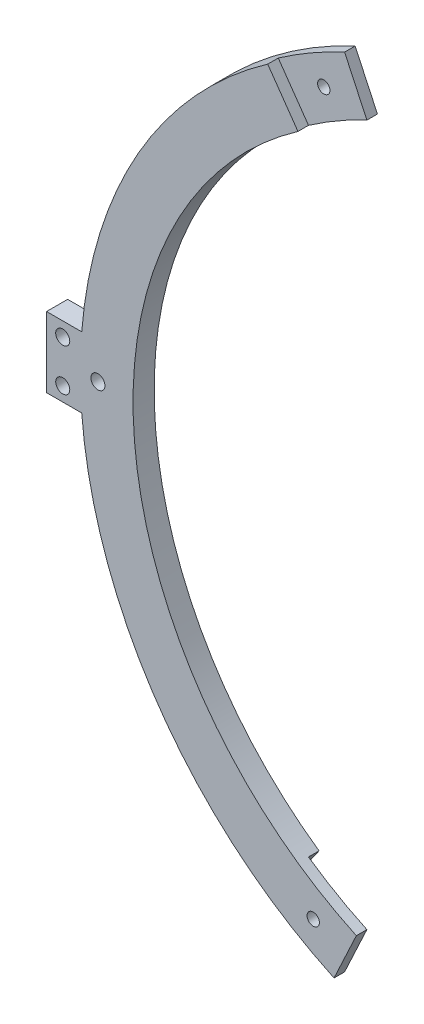
ISO-10303-21;
HEADER;
FILE_DESCRIPTION(('STEP AP214'),'2;1');
FILE_NAME('part.step','',(''),(''),'','','');
FILE_SCHEMA(('AUTOMOTIVE_DESIGN { 1 0 10303 214 1 1 1 1 }'));
ENDSEC;
DATA;
#1=APPLICATION_CONTEXT('core data for automotive mechanical design processes');
#2=APPLICATION_PROTOCOL_DEFINITION('international standard','automotive_design',2000,#1);
#3=PRODUCT_CONTEXT('',#1,'mechanical');
#4=PRODUCT('Part','Part','',(#3));
#5=PRODUCT_RELATED_PRODUCT_CATEGORY('part','',(#4));
#6=PRODUCT_DEFINITION_FORMATION('','',#4);
#7=PRODUCT_DEFINITION_CONTEXT('part definition',#1,'design');
#8=PRODUCT_DEFINITION('design','',#6,#7);
#9=PRODUCT_DEFINITION_SHAPE('','',#8);
#10=(LENGTH_UNIT() NAMED_UNIT(*) SI_UNIT(.MILLI.,.METRE.));
#11=(NAMED_UNIT(*) PLANE_ANGLE_UNIT() SI_UNIT($,.RADIAN.));
#12=(NAMED_UNIT(*) SI_UNIT($,.STERADIAN.) SOLID_ANGLE_UNIT());
#13=UNCERTAINTY_MEASURE_WITH_UNIT(LENGTH_MEASURE(1.E-05),#10,'distance_accuracy_value','');
#14=(GEOMETRIC_REPRESENTATION_CONTEXT(3) GLOBAL_UNCERTAINTY_ASSIGNED_CONTEXT((#13)) GLOBAL_UNIT_ASSIGNED_CONTEXT((#10,
#11,#12)) REPRESENTATION_CONTEXT('',''));
#15=CARTESIAN_POINT('',(0.,0.,0.));
#16=DIRECTION('',(0.,0.,1.));
#17=DIRECTION('',(1.,0.,0.));
#18=AXIS2_PLACEMENT_3D('',#15,#16,#17);
#19=CARTESIAN_POINT('',(0.,0.,6.));
#20=DIRECTION('',(0.,0.,1.));
#21=DIRECTION('',(1.,0.,0.));
#22=AXIS2_PLACEMENT_3D('',#19,#20,#21);
#23=PLANE('',#22);
#24=DIRECTION('',(0.573576436351052,-0.819152044288988,0.));
#25=VECTOR('',#24,1.);
#26=CARTESIAN_POINT('',(-71.6970545438814,102.394005536124,6.));
#27=LINE('',#26,#25);
#28=CARTESIAN_POINT('',(-71.6970545438814,102.394005536124,6.));
#29=VERTEX_POINT('',#28);
#30=CARTESIAN_POINT('',(-63.0934079986156,90.1067248717887,6.));
#31=VERTEX_POINT('',#30);
#32=EDGE_CURVE('E184',#29,#31,#27,.T.);
#33=ORIENTED_EDGE('',*,*,#32,.F.);
#34=CARTESIAN_POINT('',(0.,0.,6.));
#35=DIRECTION('',(0.,0.,1.));
#36=DIRECTION('',(1.,0.,0.));
#37=AXIS2_PLACEMENT_3D('',#34,#35,#36);
#38=CIRCLE('',#37,125.);
#39=CARTESIAN_POINT('',(-124.599357943771,9.99999999999999,6.));
#40=VERTEX_POINT('',#39);
#41=EDGE_CURVE('E205',#29,#40,#38,.T.);
#42=ORIENTED_EDGE('',*,*,#41,.T.);
#43=DIRECTION('',(-1.,0.,0.));
#44=VECTOR('',#43,1.);
#45=CARTESIAN_POINT('',(-124.599357943771,9.99999999999999,6.));
#46=LINE('',#45,#44);
#47=CARTESIAN_POINT('',(-134.599357943771,10.,6.));
#48=VERTEX_POINT('',#47);
#49=EDGE_CURVE('E207',#40,#48,#46,.T.);
#50=ORIENTED_EDGE('',*,*,#49,.T.);
#51=DIRECTION('',(0.,-1.,0.));
#52=VECTOR('',#51,1.);
#53=CARTESIAN_POINT('',(-134.599357943771,10.,6.));
#54=LINE('',#53,#52);
#55=CARTESIAN_POINT('',(-134.599357943771,-10.,6.));
#56=VERTEX_POINT('',#55);
#57=EDGE_CURVE('E210',#48,#56,#54,.T.);
#58=ORIENTED_EDGE('',*,*,#57,.T.);
#59=DIRECTION('',(1.,0.,0.));
#60=VECTOR('',#59,1.);
#61=CARTESIAN_POINT('',(-134.599357943771,-10.,6.));
#62=LINE('',#61,#60);
#63=CARTESIAN_POINT('',(-124.599357943771,-9.99999999999996,6.));
#64=VERTEX_POINT('',#63);
#65=EDGE_CURVE('E212',#56,#64,#62,.T.);
#66=ORIENTED_EDGE('',*,*,#65,.T.);
#67=CARTESIAN_POINT('',(0.,0.,6.));
#68=DIRECTION('',(0.,0.,1.));
#69=DIRECTION('',(1.,0.,0.));
#70=AXIS2_PLACEMENT_3D('',#67,#68,#69);
#71=CIRCLE('',#70,125.);
#72=CARTESIAN_POINT('',(-52.8272827175879,-113.288473379581,6.));
#73=VERTEX_POINT('',#72);
#74=EDGE_CURVE('E214',#64,#73,#71,.T.);
#75=ORIENTED_EDGE('',*,*,#74,.T.);
#76=DIRECTION('',(0.422618261740704,0.906307787036648,0.));
#77=VECTOR('',#76,1.);
#78=CARTESIAN_POINT('',(-46.4880087914774,-99.6938565740313,6.));
#79=LINE('',#78,#77);
#80=CARTESIAN_POINT('',(-46.4880087914774,-99.6938565740313,6.));
#81=VERTEX_POINT('',#80);
#82=EDGE_CURVE('E216',#73,#81,#79,.T.);
#83=ORIENTED_EDGE('',*,*,#82,.T.);
#84=CARTESIAN_POINT('',(0.,0.,6.));
#85=DIRECTION('',(0.,0.,-1.));
#86=DIRECTION('',(1.,0.,0.));
#87=AXIS2_PLACEMENT_3D('',#84,#85,#86);
#88=CIRCLE('',#87,110.);
#89=EDGE_CURVE('E151',#81,#31,#88,.T.);
#90=ORIENTED_EDGE('',*,*,#89,.T.);
#91=EDGE_LOOP('',(#33,#42,#50,#58,#66,#75,#83,#90));
#92=FACE_BOUND('',#91,.T.);
#93=CARTESIAN_POINT('',(-58.7499999999997,-101.757984944672,6.));
#94=DIRECTION('',(0.,0.,1.));
#95=DIRECTION('',(1.,0.,0.));
#96=AXIS2_PLACEMENT_3D('',#93,#94,#95);
#97=CIRCLE('',#96,1.75);
#98=CARTESIAN_POINT('',(-56.9999999999997,-101.757984944672,6.));
#99=VERTEX_POINT('',#98);
#100=EDGE_CURVE('E171',#99,#99,#97,.T.);
#101=ORIENTED_EDGE('',*,*,#100,.F.);
#102=EDGE_LOOP('',(#101));
#103=FACE_BOUND('',#102,.T.);
#104=CARTESIAN_POINT('',(-130.,6.,6.));
#105=DIRECTION('',(0.,0.,1.));
#106=DIRECTION('',(1.,0.,0.));
#107=AXIS2_PLACEMENT_3D('',#104,#105,#106);
#108=CIRCLE('',#107,2.);
#109=CARTESIAN_POINT('',(-128.,6.,6.));
#110=VERTEX_POINT('',#109);
#111=EDGE_CURVE('E193',#110,#110,#108,.T.);
#112=ORIENTED_EDGE('',*,*,#111,.F.);
#113=EDGE_LOOP('',(#112));
#114=FACE_BOUND('',#113,.T.);
#115=CARTESIAN_POINT('',(-120.,0.,6.));
#116=DIRECTION('',(0.,0.,1.));
#117=DIRECTION('',(1.,0.,0.));
#118=AXIS2_PLACEMENT_3D('',#115,#116,#117);
#119=CIRCLE('',#118,2.);
#120=CARTESIAN_POINT('',(-118.,0.,6.));
#121=VERTEX_POINT('',#120);
#122=EDGE_CURVE('E199',#121,#121,#119,.T.);
#123=ORIENTED_EDGE('',*,*,#122,.F.);
#124=EDGE_LOOP('',(#123));
#125=FACE_BOUND('',#124,.T.);
#126=CARTESIAN_POINT('',(-130.,-6.,6.));
#127=DIRECTION('',(0.,0.,1.));
#128=DIRECTION('',(1.,0.,0.));
#129=AXIS2_PLACEMENT_3D('',#126,#127,#128);
#130=CIRCLE('',#129,2.);
#131=CARTESIAN_POINT('',(-128.,-6.,6.));
#132=VERTEX_POINT('',#131);
#133=EDGE_CURVE('E187',#132,#132,#130,.T.);
#134=ORIENTED_EDGE('',*,*,#133,.F.);
#135=EDGE_LOOP('',(#134));
#136=FACE_BOUND('',#135,.T.);
#137=ADVANCED_FACE('F36',(#92,#103,#114,#125,#136),#23,.T.);
#138=CARTESIAN_POINT('',(0.,0.,0.));
#139=DIRECTION('',(0.,0.,1.));
#140=DIRECTION('',(1.,0.,0.));
#141=AXIS2_PLACEMENT_3D('',#138,#139,#140);
#142=PLANE('',#141);
#143=CARTESIAN_POINT('',(-58.7500000000005,101.757984944671,0.));
#144=DIRECTION('',(0.,0.,1.));
#145=DIRECTION('',(1.,0.,0.));
#146=AXIS2_PLACEMENT_3D('',#143,#144,#145);
#147=CIRCLE('',#146,1.75000000000002);
#148=CARTESIAN_POINT('',(-57.0000000000005,101.757984944671,0.));
#149=VERTEX_POINT('',#148);
#150=EDGE_CURVE('E168',#149,#149,#147,.T.);
#151=ORIENTED_EDGE('',*,*,#150,.T.);
#152=EDGE_LOOP('',(#151));
#153=FACE_BOUND('',#152,.T.);
#154=CARTESIAN_POINT('',(0.,0.,0.));
#155=DIRECTION('',(0.,0.,-1.));
#156=DIRECTION('',(1.,0.,0.));
#157=AXIS2_PLACEMENT_3D('',#154,#155,#156);
#158=CIRCLE('',#157,110.);
#159=CARTESIAN_POINT('',(-63.0934079986151,-90.1067248717891,0.));
#160=VERTEX_POINT('',#159);
#161=CARTESIAN_POINT('',(-46.4880087914775,99.6938565740312,0.));
#162=VERTEX_POINT('',#161);
#163=EDGE_CURVE('E230',#160,#162,#158,.T.);
#164=ORIENTED_EDGE('',*,*,#163,.F.);
#165=DIRECTION('',(0.573576436351047,0.819152044288991,0.));
#166=VECTOR('',#165,1.);
#167=CARTESIAN_POINT('',(-63.0934079986151,-90.1067248717891,0.));
#168=LINE('',#167,#166);
#169=CARTESIAN_POINT('',(-71.6970545438808,-102.394005536124,0.));
#170=VERTEX_POINT('',#169);
#171=EDGE_CURVE('E135',#170,#160,#168,.T.);
#172=ORIENTED_EDGE('',*,*,#171,.F.);
#173=CARTESIAN_POINT('',(0.,0.,0.));
#174=DIRECTION('',(0.,0.,1.));
#175=DIRECTION('',(1.,0.,0.));
#176=AXIS2_PLACEMENT_3D('',#173,#174,#175);
#177=CIRCLE('',#176,125.);
#178=CARTESIAN_POINT('',(-124.599357943771,-9.99999999999996,0.));
#179=VERTEX_POINT('',#178);
#180=EDGE_CURVE('E227',#179,#170,#177,.T.);
#181=ORIENTED_EDGE('',*,*,#180,.F.);
#182=DIRECTION('',(1.,0.,0.));
#183=VECTOR('',#182,1.);
#184=CARTESIAN_POINT('',(-134.599357943771,-10.,0.));
#185=LINE('',#184,#183);
#186=CARTESIAN_POINT('',(-134.599357943771,-10.,0.));
#187=VERTEX_POINT('',#186);
#188=EDGE_CURVE('E225',#187,#179,#185,.T.);
#189=ORIENTED_EDGE('',*,*,#188,.F.);
#190=DIRECTION('',(0.,-1.,0.));
#191=VECTOR('',#190,1.);
#192=CARTESIAN_POINT('',(-134.599357943771,10.,0.));
#193=LINE('',#192,#191);
#194=CARTESIAN_POINT('',(-134.599357943771,10.,0.));
#195=VERTEX_POINT('',#194);
#196=EDGE_CURVE('E223',#195,#187,#193,.T.);
#197=ORIENTED_EDGE('',*,*,#196,.F.);
#198=DIRECTION('',(-1.,0.,0.));
#199=VECTOR('',#198,1.);
#200=CARTESIAN_POINT('',(-124.599357943771,9.99999999999999,0.));
#201=LINE('',#200,#199);
#202=CARTESIAN_POINT('',(-124.599357943771,9.99999999999999,0.));
#203=VERTEX_POINT('',#202);
#204=EDGE_CURVE('E221',#203,#195,#201,.T.);
#205=ORIENTED_EDGE('',*,*,#204,.F.);
#206=CARTESIAN_POINT('',(0.,0.,0.));
#207=DIRECTION('',(0.,0.,1.));
#208=DIRECTION('',(1.,0.,0.));
#209=AXIS2_PLACEMENT_3D('',#206,#207,#208);
#210=CIRCLE('',#209,125.);
#211=CARTESIAN_POINT('',(-52.827282717588,113.288473379581,0.));
#212=VERTEX_POINT('',#211);
#213=EDGE_CURVE('E202',#212,#203,#210,.T.);
#214=ORIENTED_EDGE('',*,*,#213,.F.);
#215=DIRECTION('',(-0.422618261740704,0.906307787036648,0.));
#216=VECTOR('',#215,1.);
#217=CARTESIAN_POINT('',(-46.4880087914775,99.6938565740312,0.));
#218=LINE('',#217,#216);
#219=EDGE_CURVE('E208',#162,#212,#218,.T.);
#220=ORIENTED_EDGE('',*,*,#219,.F.);
#221=EDGE_LOOP('',(#164,#172,#181,#189,#197,#205,#214,#220));
#222=FACE_BOUND('',#221,.T.);
#223=CARTESIAN_POINT('',(-120.,0.,0.));
#224=DIRECTION('',(0.,0.,1.));
#225=DIRECTION('',(1.,0.,0.));
#226=AXIS2_PLACEMENT_3D('',#223,#224,#225);
#227=CIRCLE('',#226,2.);
#228=CARTESIAN_POINT('',(-118.,0.,0.));
#229=VERTEX_POINT('',#228);
#230=EDGE_CURVE('E196',#229,#229,#227,.T.);
#231=ORIENTED_EDGE('',*,*,#230,.T.);
#232=EDGE_LOOP('',(#231));
#233=FACE_BOUND('',#232,.T.);
#234=CARTESIAN_POINT('',(-130.,6.,0.));
#235=DIRECTION('',(0.,0.,1.));
#236=DIRECTION('',(1.,0.,0.));
#237=AXIS2_PLACEMENT_3D('',#234,#235,#236);
#238=CIRCLE('',#237,2.);
#239=CARTESIAN_POINT('',(-128.,6.,0.));
#240=VERTEX_POINT('',#239);
#241=EDGE_CURVE('E190',#240,#240,#238,.T.);
#242=ORIENTED_EDGE('',*,*,#241,.T.);
#243=EDGE_LOOP('',(#242));
#244=FACE_BOUND('',#243,.T.);
#245=CARTESIAN_POINT('',(-130.,-6.,0.));
#246=DIRECTION('',(0.,0.,1.));
#247=DIRECTION('',(1.,0.,0.));
#248=AXIS2_PLACEMENT_3D('',#245,#246,#247);
#249=CIRCLE('',#248,2.);
#250=CARTESIAN_POINT('',(-128.,-6.,0.));
#251=VERTEX_POINT('',#250);
#252=EDGE_CURVE('E170',#251,#251,#249,.T.);
#253=ORIENTED_EDGE('',*,*,#252,.T.);
#254=EDGE_LOOP('',(#253));
#255=FACE_BOUND('',#254,.T.);
#256=ADVANCED_FACE('F248',(#153,#222,#233,#244,#255),#142,.F.);
#257=CARTESIAN_POINT('',(0.,0.,6.));
#258=DIRECTION('',(0.,0.,-1.));
#259=DIRECTION('',(-1.,0.,0.));
#260=AXIS2_PLACEMENT_3D('',#257,#258,#259);
#261=CYLINDRICAL_SURFACE('',#260,125.);
#262=ORIENTED_EDGE('',*,*,#41,.F.);
#263=DIRECTION('',(0.,0.,1.));
#264=VECTOR('',#263,1.);
#265=CARTESIAN_POINT('',(-71.6970545438814,102.394005536124,3.));
#266=LINE('',#265,#264);
#267=CARTESIAN_POINT('',(-71.6970545438814,102.394005536124,3.));
#268=VERTEX_POINT('',#267);
#269=EDGE_CURVE('E179',#268,#29,#266,.T.);
#270=ORIENTED_EDGE('',*,*,#269,.F.);
#271=CARTESIAN_POINT('',(0.,0.,3.));
#272=DIRECTION('',(0.,0.,1.));
#273=DIRECTION('',(-1.,0.,0.));
#274=AXIS2_PLACEMENT_3D('',#271,#272,#273);
#275=CIRCLE('',#274,125.);
#276=CARTESIAN_POINT('',(-52.827282717588,113.288473379581,3.));
#277=VERTEX_POINT('',#276);
#278=EDGE_CURVE('E241',#277,#268,#275,.T.);
#279=ORIENTED_EDGE('',*,*,#278,.F.);
#280=DIRECTION('',(0.,0.,-1.));
#281=VECTOR('',#280,1.);
#282=CARTESIAN_POINT('',(-52.827282717588,113.288473379581,6.));
#283=LINE('',#282,#281);
#284=EDGE_CURVE('E157',#277,#212,#283,.T.);
#285=ORIENTED_EDGE('',*,*,#284,.T.);
#286=ORIENTED_EDGE('',*,*,#213,.T.);
#287=DIRECTION('',(0.,0.,-1.));
#288=VECTOR('',#287,1.);
#289=CARTESIAN_POINT('',(-124.599357943771,9.99999999999999,6.));
#290=LINE('',#289,#288);
#291=EDGE_CURVE('E11',#40,#203,#290,.T.);
#292=ORIENTED_EDGE('',*,*,#291,.F.);
#293=EDGE_LOOP('',(#262,#270,#279,#285,#286,#292));
#294=FACE_BOUND('',#293,.T.);
#295=ADVANCED_FACE('F38',(#294),#261,.T.);
#296=CARTESIAN_POINT('',(-124.599357943771,9.99999999999999,6.));
#297=DIRECTION('',(0.,-1.,0.));
#298=DIRECTION('',(1.,0.,0.));
#299=AXIS2_PLACEMENT_3D('',#296,#297,#298);
#300=PLANE('',#299);
#301=ORIENTED_EDGE('',*,*,#204,.T.);
#302=DIRECTION('',(0.,0.,-1.));
#303=VECTOR('',#302,1.);
#304=CARTESIAN_POINT('',(-134.599357943771,10.,6.));
#305=LINE('',#304,#303);
#306=EDGE_CURVE('E45',#48,#195,#305,.T.);
#307=ORIENTED_EDGE('',*,*,#306,.F.);
#308=ORIENTED_EDGE('',*,*,#49,.F.);
#309=ORIENTED_EDGE('',*,*,#291,.T.);
#310=EDGE_LOOP('',(#301,#307,#308,#309));
#311=FACE_BOUND('',#310,.T.);
#312=ADVANCED_FACE('F255',(#311),#300,.F.);
#313=CARTESIAN_POINT('',(-134.599357943771,10.,6.));
#314=DIRECTION('',(1.,0.,0.));
#315=DIRECTION('',(0.,0.,-1.));
#316=AXIS2_PLACEMENT_3D('',#313,#314,#315);
#317=PLANE('',#316);
#318=ORIENTED_EDGE('',*,*,#196,.T.);
#319=DIRECTION('',(0.,0.,-1.));
#320=VECTOR('',#319,1.);
#321=CARTESIAN_POINT('',(-134.599357943771,-10.,6.));
#322=LINE('',#321,#320);
#323=EDGE_CURVE('E163',#56,#187,#322,.T.);
#324=ORIENTED_EDGE('',*,*,#323,.F.);
#325=ORIENTED_EDGE('',*,*,#57,.F.);
#326=ORIENTED_EDGE('',*,*,#306,.T.);
#327=EDGE_LOOP('',(#318,#324,#325,#326));
#328=FACE_BOUND('',#327,.T.);
#329=ADVANCED_FACE('F289',(#328),#317,.F.);
#330=CARTESIAN_POINT('',(-134.599357943771,-10.,6.));
#331=DIRECTION('',(0.,1.,0.));
#332=DIRECTION('',(-1.,0.,0.));
#333=AXIS2_PLACEMENT_3D('',#330,#331,#332);
#334=PLANE('',#333);
#335=ORIENTED_EDGE('',*,*,#188,.T.);
#336=DIRECTION('',(0.,0.,-1.));
#337=VECTOR('',#336,1.);
#338=CARTESIAN_POINT('',(-124.599357943771,-9.99999999999996,6.));
#339=LINE('',#338,#337);
#340=EDGE_CURVE('E154',#64,#179,#339,.T.);
#341=ORIENTED_EDGE('',*,*,#340,.F.);
#342=ORIENTED_EDGE('',*,*,#65,.F.);
#343=ORIENTED_EDGE('',*,*,#323,.T.);
#344=EDGE_LOOP('',(#335,#341,#342,#343));
#345=FACE_BOUND('',#344,.T.);
#346=ADVANCED_FACE('F285',(#345),#334,.F.);
#347=CARTESIAN_POINT('',(0.,0.,6.));
#348=DIRECTION('',(0.,0.,-1.));
#349=DIRECTION('',(-1.,0.,0.));
#350=AXIS2_PLACEMENT_3D('',#347,#348,#349);
#351=CYLINDRICAL_SURFACE('',#350,125.);
#352=ORIENTED_EDGE('',*,*,#180,.T.);
#353=DIRECTION('',(0.,0.,-1.));
#354=VECTOR('',#353,1.);
#355=CARTESIAN_POINT('',(-71.6970545438808,-102.394005536124,3.));
#356=LINE('',#355,#354);
#357=CARTESIAN_POINT('',(-71.6970545438808,-102.394005536124,3.));
#358=VERTEX_POINT('',#357);
#359=EDGE_CURVE('E266',#358,#170,#356,.T.);
#360=ORIENTED_EDGE('',*,*,#359,.F.);
#361=CARTESIAN_POINT('',(0.,0.,3.));
#362=DIRECTION('',(0.,0.,-1.));
#363=DIRECTION('',(1.,0.,0.));
#364=AXIS2_PLACEMENT_3D('',#361,#362,#363);
#365=CIRCLE('',#364,125.);
#366=CARTESIAN_POINT('',(-52.827282717588,-113.288473379581,3.));
#367=VERTEX_POINT('',#366);
#368=EDGE_CURVE('E146',#367,#358,#365,.T.);
#369=ORIENTED_EDGE('',*,*,#368,.F.);
#370=DIRECTION('',(0.,0.,-1.));
#371=VECTOR('',#370,1.);
#372=CARTESIAN_POINT('',(-52.8272827175879,-113.288473379581,6.));
#373=LINE('',#372,#371);
#374=EDGE_CURVE('E145',#73,#367,#373,.T.);
#375=ORIENTED_EDGE('',*,*,#374,.F.);
#376=ORIENTED_EDGE('',*,*,#74,.F.);
#377=ORIENTED_EDGE('',*,*,#340,.T.);
#378=EDGE_LOOP('',(#352,#360,#369,#375,#376,#377));
#379=FACE_BOUND('',#378,.T.);
#380=ADVANCED_FACE('F280',(#379),#351,.T.);
#381=CARTESIAN_POINT('',(-46.4880087914774,-99.6938565740313,6.));
#382=DIRECTION('',(-0.906307787036648,0.422618261740704,0.));
#383=DIRECTION('',(-0.422618261740704,-0.906307787036648,0.));
#384=AXIS2_PLACEMENT_3D('',#381,#382,#383);
#385=PLANE('',#384);
#386=ORIENTED_EDGE('',*,*,#374,.T.);
#387=DIRECTION('',(-0.422618261740699,-0.90630778703665,0.));
#388=VECTOR('',#387,1.);
#389=CARTESIAN_POINT('',(-46.4880087914774,-99.6938565740313,3.));
#390=LINE('',#389,#388);
#391=CARTESIAN_POINT('',(-46.4880087914774,-99.6938565740313,3.));
#392=VERTEX_POINT('',#391);
#393=EDGE_CURVE('E130',#392,#367,#390,.T.);
#394=ORIENTED_EDGE('',*,*,#393,.F.);
#395=DIRECTION('',(0.,0.,-1.));
#396=VECTOR('',#395,1.);
#397=CARTESIAN_POINT('',(-46.4880087914774,-99.6938565740313,6.));
#398=LINE('',#397,#396);
#399=EDGE_CURVE('E142',#81,#392,#398,.T.);
#400=ORIENTED_EDGE('',*,*,#399,.F.);
#401=ORIENTED_EDGE('',*,*,#82,.F.);
#402=EDGE_LOOP('',(#386,#394,#400,#401));
#403=FACE_BOUND('',#402,.T.);
#404=ADVANCED_FACE('F140',(#403),#385,.F.);
#405=CARTESIAN_POINT('',(0.,0.,6.));
#406=DIRECTION('',(0.,0.,-1.));
#407=DIRECTION('',(-1.,0.,0.));
#408=AXIS2_PLACEMENT_3D('',#405,#406,#407);
#409=CYLINDRICAL_SURFACE('',#408,110.);
#410=CARTESIAN_POINT('',(0.,0.,3.));
#411=DIRECTION('',(0.,0.,1.));
#412=DIRECTION('',(1.,0.,0.));
#413=AXIS2_PLACEMENT_3D('',#410,#411,#412);
#414=CIRCLE('',#413,110.);
#415=CARTESIAN_POINT('',(-63.0934079986151,-90.1067248717891,3.));
#416=VERTEX_POINT('',#415);
#417=EDGE_CURVE('E126',#416,#392,#414,.T.);
#418=ORIENTED_EDGE('',*,*,#417,.F.);
#419=DIRECTION('',(0.,0.,-1.));
#420=VECTOR('',#419,1.);
#421=CARTESIAN_POINT('',(-63.0934079986151,-90.1067248717891,3.));
#422=LINE('',#421,#420);
#423=EDGE_CURVE('E263',#416,#160,#422,.T.);
#424=ORIENTED_EDGE('',*,*,#423,.T.);
#425=ORIENTED_EDGE('',*,*,#163,.T.);
#426=DIRECTION('',(0.,0.,-1.));
#427=VECTOR('',#426,1.);
#428=CARTESIAN_POINT('',(-46.4880087914775,99.6938565740312,6.));
#429=LINE('',#428,#427);
#430=CARTESIAN_POINT('',(-46.4880087914775,99.6938565740312,3.));
#431=VERTEX_POINT('',#430);
#432=EDGE_CURVE('E152',#431,#162,#429,.T.);
#433=ORIENTED_EDGE('',*,*,#432,.F.);
#434=CARTESIAN_POINT('',(0.,0.,3.));
#435=DIRECTION('',(0.,0.,-1.));
#436=DIRECTION('',(1.,0.,0.));
#437=AXIS2_PLACEMENT_3D('',#434,#435,#436);
#438=CIRCLE('',#437,110.);
#439=CARTESIAN_POINT('',(-63.0934079986156,90.1067248717887,3.));
#440=VERTEX_POINT('',#439);
#441=EDGE_CURVE('E61',#440,#431,#438,.T.);
#442=ORIENTED_EDGE('',*,*,#441,.F.);
#443=DIRECTION('',(0.,0.,1.));
#444=VECTOR('',#443,1.);
#445=CARTESIAN_POINT('',(-63.0934079986156,90.1067248717887,3.));
#446=LINE('',#445,#444);
#447=EDGE_CURVE('E174',#440,#31,#446,.T.);
#448=ORIENTED_EDGE('',*,*,#447,.T.);
#449=ORIENTED_EDGE('',*,*,#89,.F.);
#450=ORIENTED_EDGE('',*,*,#399,.T.);
#451=EDGE_LOOP('',(#418,#424,#425,#433,#442,#448,#449,#450));
#452=FACE_BOUND('',#451,.T.);
#453=ADVANCED_FACE('F148',(#452),#409,.F.);
#454=CARTESIAN_POINT('',(-46.4880087914775,99.6938565740312,6.));
#455=DIRECTION('',(-0.906307787036648,-0.422618261740704,0.));
#456=DIRECTION('',(0.422618261740704,-0.906307787036648,0.));
#457=AXIS2_PLACEMENT_3D('',#454,#455,#456);
#458=PLANE('',#457);
#459=ORIENTED_EDGE('',*,*,#284,.F.);
#460=DIRECTION('',(-0.422618261740704,0.906307787036648,0.));
#461=VECTOR('',#460,1.);
#462=CARTESIAN_POINT('',(-52.827282717588,113.288473379581,3.));
#463=LINE('',#462,#461);
#464=EDGE_CURVE('E181',#431,#277,#463,.T.);
#465=ORIENTED_EDGE('',*,*,#464,.F.);
#466=ORIENTED_EDGE('',*,*,#432,.T.);
#467=ORIENTED_EDGE('',*,*,#219,.T.);
#468=EDGE_LOOP('',(#459,#465,#466,#467));
#469=FACE_BOUND('',#468,.T.);
#470=ADVANCED_FACE('F244',(#469),#458,.F.);
#471=CARTESIAN_POINT('',(-120.,0.,6.));
#472=DIRECTION('',(0.,0.,-1.));
#473=DIRECTION('',(-1.,0.,0.));
#474=AXIS2_PLACEMENT_3D('',#471,#472,#473);
#475=CYLINDRICAL_SURFACE('',#474,2.);
#476=ORIENTED_EDGE('',*,*,#122,.T.);
#477=EDGE_LOOP('',(#476));
#478=FACE_BOUND('',#477,.T.);
#479=ORIENTED_EDGE('',*,*,#230,.F.);
#480=EDGE_LOOP('',(#479));
#481=FACE_BOUND('',#480,.T.);
#482=ADVANCED_FACE('F308',(#478,#481),#475,.F.);
#483=CARTESIAN_POINT('',(-130.,6.,6.));
#484=DIRECTION('',(0.,0.,-1.));
#485=DIRECTION('',(-1.,0.,0.));
#486=AXIS2_PLACEMENT_3D('',#483,#484,#485);
#487=CYLINDRICAL_SURFACE('',#486,2.);
#488=ORIENTED_EDGE('',*,*,#111,.T.);
#489=EDGE_LOOP('',(#488));
#490=FACE_BOUND('',#489,.T.);
#491=ORIENTED_EDGE('',*,*,#241,.F.);
#492=EDGE_LOOP('',(#491));
#493=FACE_BOUND('',#492,.T.);
#494=ADVANCED_FACE('F409',(#490,#493),#487,.F.);
#495=CARTESIAN_POINT('',(-130.,-6.,6.));
#496=DIRECTION('',(0.,0.,-1.));
#497=DIRECTION('',(-1.,0.,0.));
#498=AXIS2_PLACEMENT_3D('',#495,#496,#497);
#499=CYLINDRICAL_SURFACE('',#498,2.);
#500=ORIENTED_EDGE('',*,*,#133,.T.);
#501=EDGE_LOOP('',(#500));
#502=FACE_BOUND('',#501,.T.);
#503=ORIENTED_EDGE('',*,*,#252,.F.);
#504=EDGE_LOOP('',(#503));
#505=FACE_BOUND('',#504,.T.);
#506=ADVANCED_FACE('F370',(#502,#505),#499,.F.);
#507=CARTESIAN_POINT('',(-58.7499999999997,-101.757984944672,-4.));
#508=DIRECTION('',(0.,0.,1.));
#509=DIRECTION('',(1.,0.,0.));
#510=AXIS2_PLACEMENT_3D('',#507,#508,#509);
#511=CYLINDRICAL_SURFACE('',#510,1.75);
#512=CARTESIAN_POINT('',(-58.7499999999997,-101.757984944672,3.));
#513=DIRECTION('',(0.,0.,1.));
#514=DIRECTION('',(1.,0.,0.));
#515=AXIS2_PLACEMENT_3D('',#512,#513,#514);
#516=CIRCLE('',#515,1.75);
#517=CARTESIAN_POINT('',(-56.9999999999997,-101.757984944672,3.));
#518=VERTEX_POINT('',#517);
#519=EDGE_CURVE('E40',#518,#518,#516,.F.);
#520=ORIENTED_EDGE('',*,*,#519,.T.);
#521=EDGE_LOOP('',(#520));
#522=FACE_BOUND('',#521,.T.);
#523=ORIENTED_EDGE('',*,*,#100,.T.);
#524=EDGE_LOOP('',(#523));
#525=FACE_BOUND('',#524,.T.);
#526=ADVANCED_FACE('F364',(#522,#525),#511,.F.);
#527=CARTESIAN_POINT('',(-58.7500000000005,101.757984944671,-4.));
#528=DIRECTION('',(0.,0.,1.));
#529=DIRECTION('',(1.,0.,0.));
#530=AXIS2_PLACEMENT_3D('',#527,#528,#529);
#531=CYLINDRICAL_SURFACE('',#530,1.75000000000002);
#532=CARTESIAN_POINT('',(-58.7500000000005,101.757984944671,3.));
#533=DIRECTION('',(0.,0.,-1.));
#534=DIRECTION('',(-1.,0.,0.));
#535=AXIS2_PLACEMENT_3D('',#532,#533,#534);
#536=CIRCLE('',#535,1.75000000000002);
#537=CARTESIAN_POINT('',(-60.5000000000005,101.757984944671,3.));
#538=VERTEX_POINT('',#537);
#539=EDGE_CURVE('E172',#538,#538,#536,.F.);
#540=ORIENTED_EDGE('',*,*,#539,.T.);
#541=EDGE_LOOP('',(#540));
#542=FACE_BOUND('',#541,.T.);
#543=ORIENTED_EDGE('',*,*,#150,.F.);
#544=EDGE_LOOP('',(#543));
#545=FACE_BOUND('',#544,.T.);
#546=ADVANCED_FACE('F369',(#542,#545),#531,.F.);
#547=CARTESIAN_POINT('',(0.,0.,3.));
#548=DIRECTION('',(0.,0.,-1.));
#549=DIRECTION('',(-1.,0.,0.));
#550=AXIS2_PLACEMENT_3D('',#547,#548,#549);
#551=PLANE('',#550);
#552=ORIENTED_EDGE('',*,*,#278,.T.);
#553=DIRECTION('',(0.573576436351052,-0.819152044288988,0.));
#554=VECTOR('',#553,1.);
#555=CARTESIAN_POINT('',(-71.6970545438814,102.394005536124,3.));
#556=LINE('',#555,#554);
#557=EDGE_CURVE('E260',#268,#440,#556,.T.);
#558=ORIENTED_EDGE('',*,*,#557,.T.);
#559=ORIENTED_EDGE('',*,*,#441,.T.);
#560=ORIENTED_EDGE('',*,*,#464,.T.);
#561=EDGE_LOOP('',(#552,#558,#559,#560));
#562=FACE_BOUND('',#561,.T.);
#563=ORIENTED_EDGE('',*,*,#539,.F.);
#564=EDGE_LOOP('',(#563));
#565=FACE_BOUND('',#564,.T.);
#566=ADVANCED_FACE('F273',(#562,#565),#551,.F.);
#567=CARTESIAN_POINT('',(-71.6970545438814,102.394005536124,3.));
#568=DIRECTION('',(-0.819152044288988,-0.573576436351052,0.));
#569=DIRECTION('',(0.573576436351052,-0.819152044288988,0.));
#570=AXIS2_PLACEMENT_3D('',#567,#568,#569);
#571=PLANE('',#570);
#572=ORIENTED_EDGE('',*,*,#32,.T.);
#573=ORIENTED_EDGE('',*,*,#447,.F.);
#574=ORIENTED_EDGE('',*,*,#557,.F.);
#575=ORIENTED_EDGE('',*,*,#269,.T.);
#576=EDGE_LOOP('',(#572,#573,#574,#575));
#577=FACE_BOUND('',#576,.T.);
#578=ADVANCED_FACE('F297',(#577),#571,.F.);
#579=CARTESIAN_POINT('',(0.,0.,3.));
#580=DIRECTION('',(0.,0.,1.));
#581=DIRECTION('',(1.,0.,0.));
#582=AXIS2_PLACEMENT_3D('',#579,#580,#581);
#583=PLANE('',#582);
#584=ORIENTED_EDGE('',*,*,#417,.T.);
#585=ORIENTED_EDGE('',*,*,#393,.T.);
#586=ORIENTED_EDGE('',*,*,#368,.T.);
#587=DIRECTION('',(0.573576436351047,0.819152044288991,0.));
#588=VECTOR('',#587,1.);
#589=CARTESIAN_POINT('',(-63.0934079986151,-90.1067248717891,3.));
#590=LINE('',#589,#588);
#591=EDGE_CURVE('E53',#358,#416,#590,.T.);
#592=ORIENTED_EDGE('',*,*,#591,.T.);
#593=EDGE_LOOP('',(#584,#585,#586,#592));
#594=FACE_BOUND('',#593,.T.);
#595=ORIENTED_EDGE('',*,*,#519,.F.);
#596=EDGE_LOOP('',(#595));
#597=FACE_BOUND('',#596,.T.);
#598=ADVANCED_FACE('F128',(#594,#597),#583,.F.);
#599=CARTESIAN_POINT('',(-63.0934079986151,-90.1067248717891,3.));
#600=DIRECTION('',(-0.819152044288991,0.573576436351047,0.));
#601=DIRECTION('',(-0.573576436351047,-0.819152044288991,0.));
#602=AXIS2_PLACEMENT_3D('',#599,#600,#601);
#603=PLANE('',#602);
#604=ORIENTED_EDGE('',*,*,#171,.T.);
#605=ORIENTED_EDGE('',*,*,#423,.F.);
#606=ORIENTED_EDGE('',*,*,#591,.F.);
#607=ORIENTED_EDGE('',*,*,#359,.T.);
#608=EDGE_LOOP('',(#604,#605,#606,#607));
#609=FACE_BOUND('',#608,.T.);
#610=ADVANCED_FACE('F291',(#609),#603,.F.);
#611=CLOSED_SHELL('',(#137,#256,#295,#312,#329,#346,#380,#404,#453,#470,#482,#494,#506,#526,
#546,#566,#578,#598,#610));
#612=MANIFOLD_SOLID_BREP('B2',#611);
#613=ADVANCED_BREP_SHAPE_REPRESENTATION('',(#18,#612),#14);
#614=SHAPE_DEFINITION_REPRESENTATION(#9,#613);
ENDSEC;
END-ISO-10303-21;
